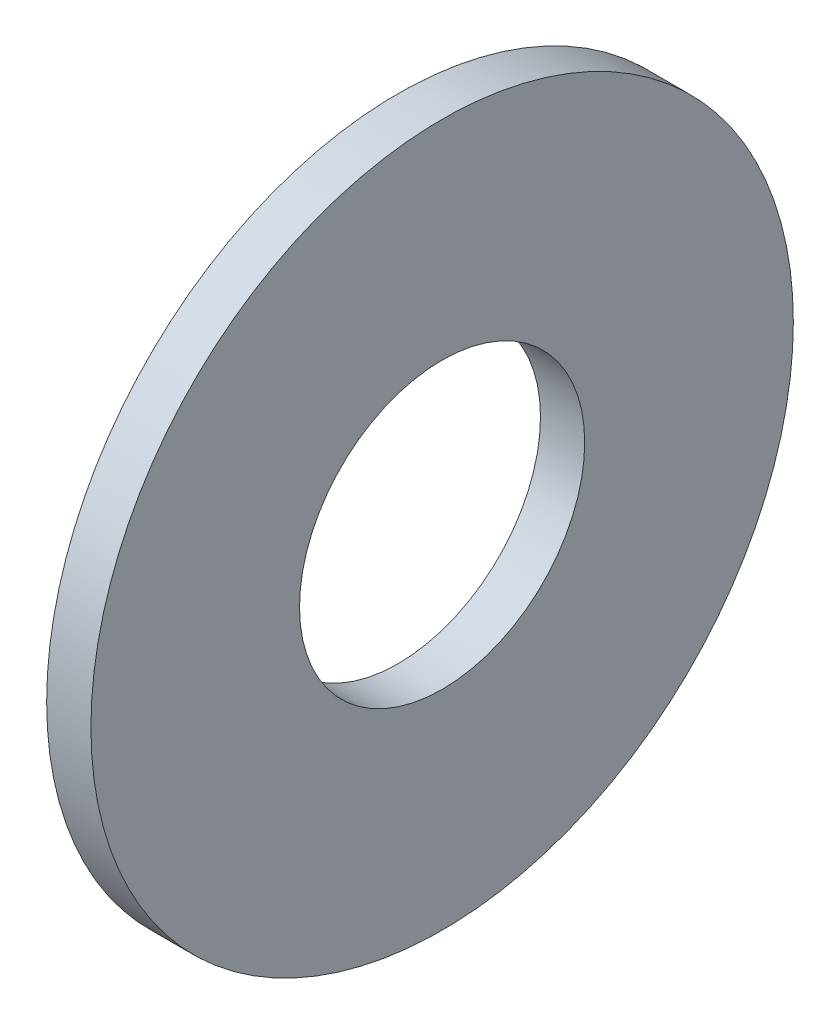
ISO-10303-21;
HEADER;
FILE_DESCRIPTION(('STEP AP214'),'2;1');
FILE_NAME('part.step','',(''),(''),'','','');
FILE_SCHEMA(('AUTOMOTIVE_DESIGN { 1 0 10303 214 1 1 1 1 }'));
ENDSEC;
DATA;
#1=APPLICATION_CONTEXT('core data for automotive mechanical design processes');
#2=APPLICATION_PROTOCOL_DEFINITION('international standard','automotive_design',2000,#1);
#3=PRODUCT_CONTEXT('',#1,'mechanical');
#4=PRODUCT('Part','Part','',(#3));
#5=PRODUCT_RELATED_PRODUCT_CATEGORY('part','',(#4));
#6=PRODUCT_DEFINITION_FORMATION('','',#4);
#7=PRODUCT_DEFINITION_CONTEXT('part definition',#1,'design');
#8=PRODUCT_DEFINITION('design','',#6,#7);
#9=PRODUCT_DEFINITION_SHAPE('','',#8);
#10=(LENGTH_UNIT() NAMED_UNIT(*) SI_UNIT(.MILLI.,.METRE.));
#11=(NAMED_UNIT(*) PLANE_ANGLE_UNIT() SI_UNIT($,.RADIAN.));
#12=(NAMED_UNIT(*) SI_UNIT($,.STERADIAN.) SOLID_ANGLE_UNIT());
#13=UNCERTAINTY_MEASURE_WITH_UNIT(LENGTH_MEASURE(1.E-05),#10,'distance_accuracy_value','');
#14=(GEOMETRIC_REPRESENTATION_CONTEXT(3) GLOBAL_UNCERTAINTY_ASSIGNED_CONTEXT((#13)) GLOBAL_UNIT_ASSIGNED_CONTEXT((#10,
#11,#12)) REPRESENTATION_CONTEXT('',''));
#15=CARTESIAN_POINT('',(0.,0.,0.));
#16=DIRECTION('',(0.,0.,1.));
#17=DIRECTION('',(1.,0.,0.));
#18=AXIS2_PLACEMENT_3D('',#15,#16,#17);
#19=CARTESIAN_POINT('',(-34.9249999999999,0.,0.));
#20=DIRECTION('',(-1.,0.,0.));
#21=DIRECTION('',(0.,0.,1.));
#22=AXIS2_PLACEMENT_3D('',#19,#20,#21);
#23=CYLINDRICAL_SURFACE('',#22,5.1562);
#24=CARTESIAN_POINT('',(0.,0.,0.));
#25=DIRECTION('',(-1.,0.,0.));
#26=DIRECTION('',(0.,0.,1.));
#27=AXIS2_PLACEMENT_3D('',#24,#25,#26);
#28=CIRCLE('',#27,5.1562);
#29=CARTESIAN_POINT('',(0.,0.,5.1562));
#30=VERTEX_POINT('',#29);
#31=EDGE_CURVE('E10',#30,#30,#28,.T.);
#32=ORIENTED_EDGE('',*,*,#31,.F.);
#33=EDGE_LOOP('',(#32));
#34=FACE_BOUND('',#33,.T.);
#35=CARTESIAN_POINT('',(-1.6002,0.,0.));
#36=DIRECTION('',(-1.,0.,0.));
#37=DIRECTION('',(0.,0.,1.));
#38=AXIS2_PLACEMENT_3D('',#35,#36,#37);
#39=CIRCLE('',#38,5.1562);
#40=CARTESIAN_POINT('',(-1.6002,0.,5.1562));
#41=VERTEX_POINT('',#40);
#42=EDGE_CURVE('E48',#41,#41,#39,.T.);
#43=ORIENTED_EDGE('',*,*,#42,.T.);
#44=EDGE_LOOP('',(#43));
#45=FACE_BOUND('',#44,.T.);
#46=ADVANCED_FACE('F34',(#34,#45),#23,.F.);
#47=CARTESIAN_POINT('',(0.,5.1562,0.));
#48=DIRECTION('',(-1.,0.,0.));
#49=DIRECTION('',(0.,0.,1.));
#50=AXIS2_PLACEMENT_3D('',#47,#48,#49);
#51=PLANE('',#50);
#52=CARTESIAN_POINT('',(0.,0.,0.));
#53=DIRECTION('',(-1.,0.,0.));
#54=DIRECTION('',(0.,0.,1.));
#55=AXIS2_PLACEMENT_3D('',#52,#53,#54);
#56=CIRCLE('',#55,12.7);
#57=CARTESIAN_POINT('',(0.,0.,12.7));
#58=VERTEX_POINT('',#57);
#59=EDGE_CURVE('E40',#58,#58,#56,.T.);
#60=ORIENTED_EDGE('',*,*,#59,.F.);
#61=EDGE_LOOP('',(#60));
#62=FACE_BOUND('',#61,.T.);
#63=ORIENTED_EDGE('',*,*,#31,.T.);
#64=EDGE_LOOP('',(#63));
#65=FACE_BOUND('',#64,.T.);
#66=ADVANCED_FACE('F63',(#62,#65),#51,.F.);
#67=CARTESIAN_POINT('',(-34.9249999999999,0.,0.));
#68=DIRECTION('',(-1.,0.,0.));
#69=DIRECTION('',(0.,0.,1.));
#70=AXIS2_PLACEMENT_3D('',#67,#68,#69);
#71=CYLINDRICAL_SURFACE('',#70,12.7);
#72=CARTESIAN_POINT('',(-1.6002,0.,0.));
#73=DIRECTION('',(-1.,0.,0.));
#74=DIRECTION('',(0.,0.,1.));
#75=AXIS2_PLACEMENT_3D('',#72,#73,#74);
#76=CIRCLE('',#75,12.7);
#77=CARTESIAN_POINT('',(-1.6002,0.,12.7));
#78=VERTEX_POINT('',#77);
#79=EDGE_CURVE('E44',#78,#78,#76,.T.);
#80=ORIENTED_EDGE('',*,*,#79,.F.);
#81=EDGE_LOOP('',(#80));
#82=FACE_BOUND('',#81,.T.);
#83=ORIENTED_EDGE('',*,*,#59,.T.);
#84=EDGE_LOOP('',(#83));
#85=FACE_BOUND('',#84,.T.);
#86=ADVANCED_FACE('F58',(#82,#85),#71,.T.);
#87=CARTESIAN_POINT('',(-1.6002,12.7,0.));
#88=DIRECTION('',(1.,0.,0.));
#89=DIRECTION('',(0.,0.,-1.));
#90=AXIS2_PLACEMENT_3D('',#87,#88,#89);
#91=PLANE('',#90);
#92=ORIENTED_EDGE('',*,*,#42,.F.);
#93=EDGE_LOOP('',(#92));
#94=FACE_BOUND('',#93,.T.);
#95=ORIENTED_EDGE('',*,*,#79,.T.);
#96=EDGE_LOOP('',(#95));
#97=FACE_BOUND('',#96,.T.);
#98=ADVANCED_FACE('F55',(#94,#97),#91,.F.);
#99=CLOSED_SHELL('',(#46,#66,#86,#98));
#100=MANIFOLD_SOLID_BREP('B2',#99);
#101=ADVANCED_BREP_SHAPE_REPRESENTATION('',(#18,#100),#14);
#102=SHAPE_DEFINITION_REPRESENTATION(#9,#101);
ENDSEC;
END-ISO-10303-21;
